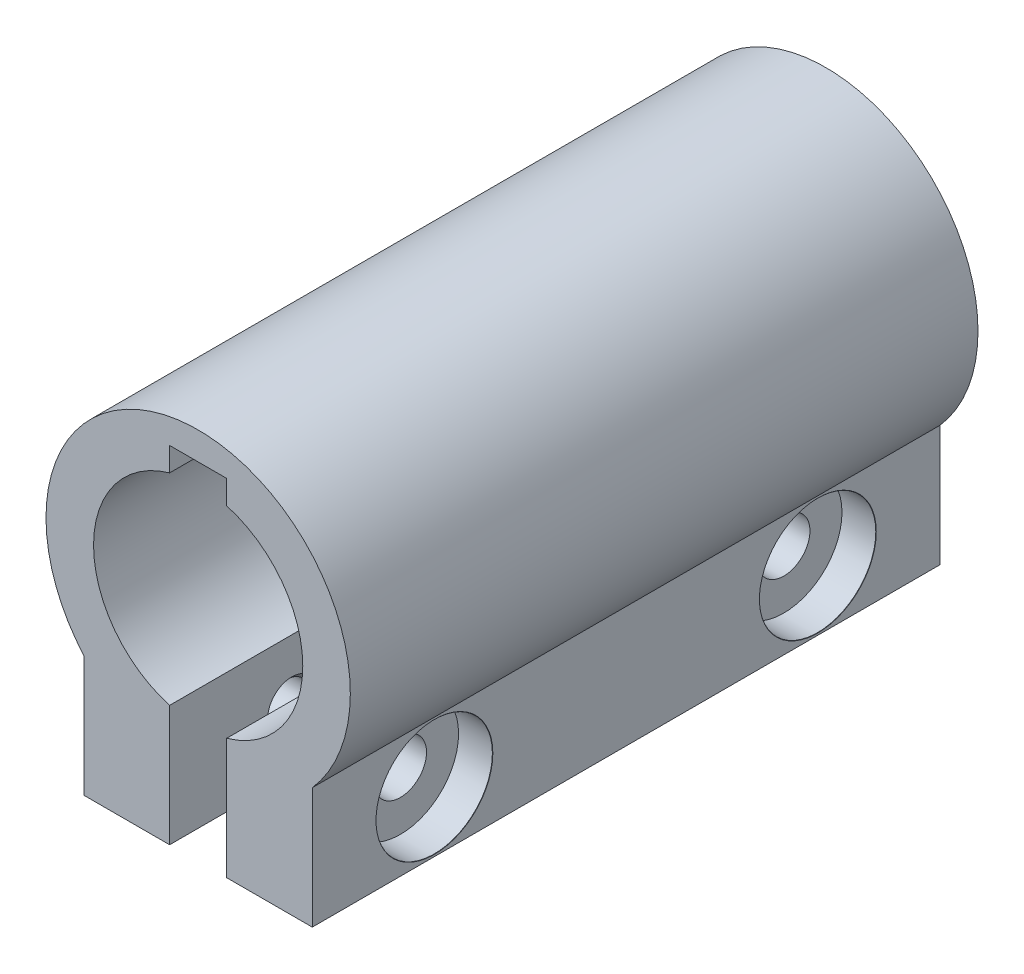
ISO-10303-21;
HEADER;
FILE_DESCRIPTION(('STEP AP214'),'2;1');
FILE_NAME('part.step','',(''),(''),'','','');
FILE_SCHEMA(('AUTOMOTIVE_DESIGN { 1 0 10303 214 1 1 1 1 }'));
ENDSEC;
DATA;
#1=APPLICATION_CONTEXT('core data for automotive mechanical design processes');
#2=APPLICATION_PROTOCOL_DEFINITION('international standard','automotive_design',2000,#1);
#3=PRODUCT_CONTEXT('',#1,'mechanical');
#4=PRODUCT('Part','Part','',(#3));
#5=PRODUCT_RELATED_PRODUCT_CATEGORY('part','',(#4));
#6=PRODUCT_DEFINITION_FORMATION('','',#4);
#7=PRODUCT_DEFINITION_CONTEXT('part definition',#1,'design');
#8=PRODUCT_DEFINITION('design','',#6,#7);
#9=PRODUCT_DEFINITION_SHAPE('','',#8);
#10=(LENGTH_UNIT() NAMED_UNIT(*) SI_UNIT(.MILLI.,.METRE.));
#11=(NAMED_UNIT(*) PLANE_ANGLE_UNIT() SI_UNIT($,.RADIAN.));
#12=(NAMED_UNIT(*) SI_UNIT($,.STERADIAN.) SOLID_ANGLE_UNIT());
#13=UNCERTAINTY_MEASURE_WITH_UNIT(LENGTH_MEASURE(1.E-05),#10,'distance_accuracy_value','');
#14=(GEOMETRIC_REPRESENTATION_CONTEXT(3) GLOBAL_UNCERTAINTY_ASSIGNED_CONTEXT((#13)) GLOBAL_UNIT_ASSIGNED_CONTEXT((#10,
#11,#12)) REPRESENTATION_CONTEXT('',''));
#15=CARTESIAN_POINT('',(0.,0.,0.));
#16=DIRECTION('',(0.,0.,1.));
#17=DIRECTION('',(1.,0.,0.));
#18=AXIS2_PLACEMENT_3D('',#15,#16,#17);
#19=CARTESIAN_POINT('',(0.,0.,-33.));
#20=DIRECTION('',(0.,0.,1.));
#21=DIRECTION('',(1.,0.,0.));
#22=AXIS2_PLACEMENT_3D('',#19,#20,#21);
#23=CYLINDRICAL_SURFACE('',#22,11.);
#24=CARTESIAN_POINT('',(0.,0.,33.));
#25=DIRECTION('',(0.,0.,1.));
#26=DIRECTION('',(1.,0.,0.));
#27=AXIS2_PLACEMENT_3D('',#24,#25,#26);
#28=CIRCLE('',#27,11.);
#29=CARTESIAN_POINT('',(-3.,10.5830052442584,33.));
#30=VERTEX_POINT('',#29);
#31=CARTESIAN_POINT('',(-3.,-10.5830052442584,33.));
#32=VERTEX_POINT('',#31);
#33=EDGE_CURVE('E160',#30,#32,#28,.T.);
#34=ORIENTED_EDGE('',*,*,#33,.T.);
#35=DIRECTION('',(0.,0.,1.));
#36=VECTOR('',#35,1.);
#37=CARTESIAN_POINT('',(-3.,-10.5830052442584,-33.));
#38=LINE('',#37,#36);
#39=CARTESIAN_POINT('',(-3.,-10.5830052442584,-33.));
#40=VERTEX_POINT('',#39);
#41=EDGE_CURVE('E151',#40,#32,#38,.T.);
#42=ORIENTED_EDGE('',*,*,#41,.F.);
#43=CARTESIAN_POINT('',(0.,0.,-33.));
#44=DIRECTION('',(0.,0.,1.));
#45=DIRECTION('',(1.,0.,0.));
#46=AXIS2_PLACEMENT_3D('',#43,#44,#45);
#47=CIRCLE('',#46,11.);
#48=CARTESIAN_POINT('',(-3.,10.5830052442584,-33.));
#49=VERTEX_POINT('',#48);
#50=EDGE_CURVE('E47',#49,#40,#47,.T.);
#51=ORIENTED_EDGE('',*,*,#50,.F.);
#52=DIRECTION('',(0.,0.,1.));
#53=VECTOR('',#52,1.);
#54=CARTESIAN_POINT('',(-3.,10.5830052442584,0.));
#55=LINE('',#54,#53);
#56=EDGE_CURVE('E256',#49,#30,#55,.T.);
#57=ORIENTED_EDGE('',*,*,#56,.T.);
#58=EDGE_LOOP('',(#34,#42,#51,#57));
#59=FACE_BOUND('',#58,.T.);
#60=ADVANCED_FACE('F38',(#59),#23,.F.);
#61=CARTESIAN_POINT('',(0.,0.,-33.));
#62=DIRECTION('',(0.,0.,1.));
#63=DIRECTION('',(1.,0.,0.));
#64=AXIS2_PLACEMENT_3D('',#61,#62,#63);
#65=CYLINDRICAL_SURFACE('',#64,16.);
#66=DIRECTION('',(0.,0.,1.));
#67=VECTOR('',#66,1.);
#68=CARTESIAN_POINT('',(12.,-10.5830052442584,-33.));
#69=LINE('',#68,#67);
#70=CARTESIAN_POINT('',(12.,-10.5830052442584,-33.));
#71=VERTEX_POINT('',#70);
#72=CARTESIAN_POINT('',(12.,-10.5830052442584,33.));
#73=VERTEX_POINT('',#72);
#74=EDGE_CURVE('E216',#71,#73,#69,.T.);
#75=ORIENTED_EDGE('',*,*,#74,.F.);
#76=CARTESIAN_POINT('',(0.,0.,-33.));
#77=DIRECTION('',(0.,0.,1.));
#78=DIRECTION('',(1.,0.,0.));
#79=AXIS2_PLACEMENT_3D('',#76,#77,#78);
#80=CIRCLE('',#79,16.);
#81=CARTESIAN_POINT('',(-12.,-10.5830052442584,-33.));
#82=VERTEX_POINT('',#81);
#83=EDGE_CURVE('E11',#71,#82,#80,.T.);
#84=ORIENTED_EDGE('',*,*,#83,.T.);
#85=DIRECTION('',(0.,0.,1.));
#86=VECTOR('',#85,1.);
#87=CARTESIAN_POINT('',(-12.,-10.5830052442584,-33.));
#88=LINE('',#87,#86);
#89=CARTESIAN_POINT('',(-12.,-10.5830052442584,33.));
#90=VERTEX_POINT('',#89);
#91=EDGE_CURVE('E232',#82,#90,#88,.T.);
#92=ORIENTED_EDGE('',*,*,#91,.T.);
#93=CARTESIAN_POINT('',(0.,0.,33.));
#94=DIRECTION('',(0.,0.,1.));
#95=DIRECTION('',(1.,0.,0.));
#96=AXIS2_PLACEMENT_3D('',#93,#94,#95);
#97=CIRCLE('',#96,16.);
#98=EDGE_CURVE('E158',#73,#90,#97,.T.);
#99=ORIENTED_EDGE('',*,*,#98,.F.);
#100=EDGE_LOOP('',(#75,#84,#92,#99));
#101=FACE_BOUND('',#100,.T.);
#102=ADVANCED_FACE('F40',(#101),#65,.T.);
#103=CARTESIAN_POINT('',(0.,0.,-33.));
#104=DIRECTION('',(0.,0.,1.));
#105=DIRECTION('',(1.,0.,0.));
#106=AXIS2_PLACEMENT_3D('',#103,#104,#105);
#107=PLANE('',#106);
#108=ORIENTED_EDGE('',*,*,#50,.T.);
#109=DIRECTION('',(0.,-1.,0.));
#110=VECTOR('',#109,1.);
#111=CARTESIAN_POINT('',(-3.,0.,-33.));
#112=LINE('',#111,#110);
#113=CARTESIAN_POINT('',(-3.,-23.2830052442584,-33.));
#114=VERTEX_POINT('',#113);
#115=EDGE_CURVE('E224',#40,#114,#112,.T.);
#116=ORIENTED_EDGE('',*,*,#115,.T.);
#117=DIRECTION('',(-1.,0.,0.));
#118=VECTOR('',#117,1.);
#119=CARTESIAN_POINT('',(0.,-23.2830052442584,-33.));
#120=LINE('',#119,#118);
#121=CARTESIAN_POINT('',(-12.,-23.2830052442584,-33.));
#122=VERTEX_POINT('',#121);
#123=EDGE_CURVE('E222',#114,#122,#120,.T.);
#124=ORIENTED_EDGE('',*,*,#123,.T.);
#125=DIRECTION('',(0.,1.,0.));
#126=VECTOR('',#125,1.);
#127=CARTESIAN_POINT('',(-12.,0.,-33.));
#128=LINE('',#127,#126);
#129=EDGE_CURVE('E219',#122,#82,#128,.T.);
#130=ORIENTED_EDGE('',*,*,#129,.T.);
#131=ORIENTED_EDGE('',*,*,#83,.F.);
#132=DIRECTION('',(0.,1.,0.));
#133=VECTOR('',#132,1.);
#134=CARTESIAN_POINT('',(12.,0.,-33.));
#135=LINE('',#134,#133);
#136=CARTESIAN_POINT('',(12.,-23.2830052442584,-33.));
#137=VERTEX_POINT('',#136);
#138=EDGE_CURVE('E143',#137,#71,#135,.T.);
#139=ORIENTED_EDGE('',*,*,#138,.F.);
#140=DIRECTION('',(1.,0.,0.));
#141=VECTOR('',#140,1.);
#142=CARTESIAN_POINT('',(0.,-23.2830052442584,-33.));
#143=LINE('',#142,#141);
#144=CARTESIAN_POINT('',(2.99999999999998,-23.2830052442584,-33.));
#145=VERTEX_POINT('',#144);
#146=EDGE_CURVE('E138',#145,#137,#143,.T.);
#147=ORIENTED_EDGE('',*,*,#146,.F.);
#148=DIRECTION('',(0.,-1.,0.));
#149=VECTOR('',#148,1.);
#150=CARTESIAN_POINT('',(3.00000000000003,0.,-33.));
#151=LINE('',#150,#149);
#152=CARTESIAN_POINT('',(3.,-10.5830052442584,-33.));
#153=VERTEX_POINT('',#152);
#154=EDGE_CURVE('E128',#153,#145,#151,.T.);
#155=ORIENTED_EDGE('',*,*,#154,.F.);
#156=CARTESIAN_POINT('',(3.,10.5830052442584,-33.));
#157=VERTEX_POINT('',#156);
#158=EDGE_CURVE('E134',#153,#157,#47,.T.);
#159=ORIENTED_EDGE('',*,*,#158,.T.);
#160=DIRECTION('',(0.,1.,0.));
#161=VECTOR('',#160,1.);
#162=CARTESIAN_POINT('',(3.,13.0830052442584,-33.));
#163=LINE('',#162,#161);
#164=CARTESIAN_POINT('',(3.,13.0830052442584,-33.));
#165=VERTEX_POINT('',#164);
#166=EDGE_CURVE('E246',#157,#165,#163,.T.);
#167=ORIENTED_EDGE('',*,*,#166,.T.);
#168=DIRECTION('',(-1.,0.,0.));
#169=VECTOR('',#168,1.);
#170=CARTESIAN_POINT('',(0.,13.0830052442584,-33.));
#171=LINE('',#170,#169);
#172=CARTESIAN_POINT('',(-3.,13.0830052442584,-33.));
#173=VERTEX_POINT('',#172);
#174=EDGE_CURVE('E243',#165,#173,#171,.T.);
#175=ORIENTED_EDGE('',*,*,#174,.T.);
#176=DIRECTION('',(0.,-1.,0.));
#177=VECTOR('',#176,1.);
#178=CARTESIAN_POINT('',(-3.,10.5830052442584,-33.));
#179=LINE('',#178,#177);
#180=EDGE_CURVE('E235',#173,#49,#179,.T.);
#181=ORIENTED_EDGE('',*,*,#180,.T.);
#182=EDGE_LOOP('',(#108,#116,#124,#130,#131,#139,#147,#155,#159,#167,#175,#181));
#183=FACE_BOUND('',#182,.T.);
#184=ADVANCED_FACE('F131',(#183),#107,.F.);
#185=ORIENTED_EDGE('',*,*,#158,.F.);
#186=DIRECTION('',(0.,0.,1.));
#187=VECTOR('',#186,1.);
#188=CARTESIAN_POINT('',(3.,-10.5830052442584,-33.));
#189=LINE('',#188,#187);
#190=CARTESIAN_POINT('',(3.,-10.5830052442584,33.));
#191=VERTEX_POINT('',#190);
#192=EDGE_CURVE('E146',#153,#191,#189,.T.);
#193=ORIENTED_EDGE('',*,*,#192,.T.);
#194=CARTESIAN_POINT('',(3.,10.5830052442584,33.));
#195=VERTEX_POINT('',#194);
#196=EDGE_CURVE('E259',#191,#195,#28,.T.);
#197=ORIENTED_EDGE('',*,*,#196,.T.);
#198=DIRECTION('',(0.,0.,1.));
#199=VECTOR('',#198,1.);
#200=CARTESIAN_POINT('',(3.,10.5830052442584,0.));
#201=LINE('',#200,#199);
#202=EDGE_CURVE('E156',#157,#195,#201,.T.);
#203=ORIENTED_EDGE('',*,*,#202,.F.);
#204=EDGE_LOOP('',(#185,#193,#197,#203));
#205=FACE_BOUND('',#204,.T.);
#206=ADVANCED_FACE('F154',(#205),#23,.F.);
#207=CARTESIAN_POINT('',(0.,0.,33.));
#208=DIRECTION('',(0.,0.,1.));
#209=DIRECTION('',(1.,0.,0.));
#210=AXIS2_PLACEMENT_3D('',#207,#208,#209);
#211=PLANE('',#210);
#212=DIRECTION('',(0.,-1.,0.));
#213=VECTOR('',#212,1.);
#214=CARTESIAN_POINT('',(-3.,0.,33.));
#215=LINE('',#214,#213);
#216=CARTESIAN_POINT('',(-3.,-23.2830052442584,33.));
#217=VERTEX_POINT('',#216);
#218=EDGE_CURVE('E55',#32,#217,#215,.T.);
#219=ORIENTED_EDGE('',*,*,#218,.F.);
#220=ORIENTED_EDGE('',*,*,#33,.F.);
#221=DIRECTION('',(0.,-1.,0.));
#222=VECTOR('',#221,1.);
#223=CARTESIAN_POINT('',(-3.,10.5830052442584,33.));
#224=LINE('',#223,#222);
#225=CARTESIAN_POINT('',(-3.,13.0830052442584,33.));
#226=VERTEX_POINT('',#225);
#227=EDGE_CURVE('E254',#226,#30,#224,.T.);
#228=ORIENTED_EDGE('',*,*,#227,.F.);
#229=DIRECTION('',(-1.,0.,0.));
#230=VECTOR('',#229,1.);
#231=CARTESIAN_POINT('',(-3.,13.0830052442584,33.));
#232=LINE('',#231,#230);
#233=CARTESIAN_POINT('',(3.,13.0830052442584,33.));
#234=VERTEX_POINT('',#233);
#235=EDGE_CURVE('E251',#234,#226,#232,.T.);
#236=ORIENTED_EDGE('',*,*,#235,.F.);
#237=DIRECTION('',(0.,1.,0.));
#238=VECTOR('',#237,1.);
#239=CARTESIAN_POINT('',(3.,13.0830052442584,33.));
#240=LINE('',#239,#238);
#241=EDGE_CURVE('E248',#195,#234,#240,.T.);
#242=ORIENTED_EDGE('',*,*,#241,.F.);
#243=ORIENTED_EDGE('',*,*,#196,.F.);
#244=DIRECTION('',(0.,-1.,0.));
#245=VECTOR('',#244,1.);
#246=CARTESIAN_POINT('',(3.00000000000003,0.,33.));
#247=LINE('',#246,#245);
#248=CARTESIAN_POINT('',(2.99999999999998,-23.2830052442584,33.));
#249=VERTEX_POINT('',#248);
#250=EDGE_CURVE('E148',#191,#249,#247,.T.);
#251=ORIENTED_EDGE('',*,*,#250,.T.);
#252=DIRECTION('',(1.,0.,0.));
#253=VECTOR('',#252,1.);
#254=CARTESIAN_POINT('',(0.,-23.2830052442584,33.));
#255=LINE('',#254,#253);
#256=CARTESIAN_POINT('',(12.,-23.2830052442584,33.));
#257=VERTEX_POINT('',#256);
#258=EDGE_CURVE('E206',#249,#257,#255,.T.);
#259=ORIENTED_EDGE('',*,*,#258,.T.);
#260=DIRECTION('',(0.,1.,0.));
#261=VECTOR('',#260,1.);
#262=CARTESIAN_POINT('',(12.,0.,33.));
#263=LINE('',#262,#261);
#264=EDGE_CURVE('E62',#257,#73,#263,.T.);
#265=ORIENTED_EDGE('',*,*,#264,.T.);
#266=ORIENTED_EDGE('',*,*,#98,.T.);
#267=DIRECTION('',(0.,1.,0.));
#268=VECTOR('',#267,1.);
#269=CARTESIAN_POINT('',(-12.,0.,33.));
#270=LINE('',#269,#268);
#271=CARTESIAN_POINT('',(-12.,-23.2830052442584,33.));
#272=VERTEX_POINT('',#271);
#273=EDGE_CURVE('E215',#272,#90,#270,.T.);
#274=ORIENTED_EDGE('',*,*,#273,.F.);
#275=DIRECTION('',(-1.,0.,0.));
#276=VECTOR('',#275,1.);
#277=CARTESIAN_POINT('',(0.,-23.2830052442584,33.));
#278=LINE('',#277,#276);
#279=EDGE_CURVE('E229',#217,#272,#278,.T.);
#280=ORIENTED_EDGE('',*,*,#279,.F.);
#281=EDGE_LOOP('',(#219,#220,#228,#236,#242,#243,#251,#259,#265,#266,#274,#280));
#282=FACE_BOUND('',#281,.T.);
#283=ADVANCED_FACE('F271',(#282),#211,.T.);
#284=CARTESIAN_POINT('',(-3.,10.5830052442584,0.));
#285=DIRECTION('',(-1.,0.,0.));
#286=DIRECTION('',(0.,0.,1.));
#287=AXIS2_PLACEMENT_3D('',#284,#285,#286);
#288=PLANE('',#287);
#289=ORIENTED_EDGE('',*,*,#227,.T.);
#290=ORIENTED_EDGE('',*,*,#56,.F.);
#291=ORIENTED_EDGE('',*,*,#180,.F.);
#292=DIRECTION('',(0.,0.,1.));
#293=VECTOR('',#292,1.);
#294=CARTESIAN_POINT('',(-3.,13.0830052442584,0.));
#295=LINE('',#294,#293);
#296=EDGE_CURVE('E260',#173,#226,#295,.T.);
#297=ORIENTED_EDGE('',*,*,#296,.T.);
#298=EDGE_LOOP('',(#289,#290,#291,#297));
#299=FACE_BOUND('',#298,.T.);
#300=ADVANCED_FACE('F327',(#299),#288,.F.);
#301=CARTESIAN_POINT('',(-3.,13.0830052442584,0.));
#302=DIRECTION('',(0.,1.,0.));
#303=DIRECTION('',(0.,0.,1.));
#304=AXIS2_PLACEMENT_3D('',#301,#302,#303);
#305=PLANE('',#304);
#306=ORIENTED_EDGE('',*,*,#235,.T.);
#307=ORIENTED_EDGE('',*,*,#296,.F.);
#308=ORIENTED_EDGE('',*,*,#174,.F.);
#309=DIRECTION('',(0.,0.,1.));
#310=VECTOR('',#309,1.);
#311=CARTESIAN_POINT('',(3.,13.0830052442584,0.));
#312=LINE('',#311,#310);
#313=EDGE_CURVE('E262',#165,#234,#312,.T.);
#314=ORIENTED_EDGE('',*,*,#313,.T.);
#315=EDGE_LOOP('',(#306,#307,#308,#314));
#316=FACE_BOUND('',#315,.T.);
#317=ADVANCED_FACE('F274',(#316),#305,.F.);
#318=CARTESIAN_POINT('',(3.,13.0830052442584,0.));
#319=DIRECTION('',(1.,0.,0.));
#320=DIRECTION('',(0.,0.,-1.));
#321=AXIS2_PLACEMENT_3D('',#318,#319,#320);
#322=PLANE('',#321);
#323=ORIENTED_EDGE('',*,*,#241,.T.);
#324=ORIENTED_EDGE('',*,*,#313,.F.);
#325=ORIENTED_EDGE('',*,*,#166,.F.);
#326=ORIENTED_EDGE('',*,*,#202,.T.);
#327=EDGE_LOOP('',(#323,#324,#325,#326));
#328=FACE_BOUND('',#327,.T.);
#329=ADVANCED_FACE('F269',(#328),#322,.F.);
#330=CARTESIAN_POINT('',(-12.,0.,-33.));
#331=DIRECTION('',(1.,0.,0.));
#332=DIRECTION('',(0.,0.,-1.));
#333=AXIS2_PLACEMENT_3D('',#330,#331,#332);
#334=PLANE('',#333);
#335=CARTESIAN_POINT('',(-12.,-16.9330052442584,-20.1581671408917));
#336=DIRECTION('',(1.,0.,0.));
#337=DIRECTION('',(0.,0.,-1.));
#338=AXIS2_PLACEMENT_3D('',#335,#336,#337);
#339=CIRCLE('',#338,2.1);
#340=CARTESIAN_POINT('',(-12.,-16.9330052442584,-22.2581671408917));
#341=VERTEX_POINT('',#340);
#342=EDGE_CURVE('E42',#341,#341,#339,.T.);
#343=ORIENTED_EDGE('',*,*,#342,.T.);
#344=EDGE_LOOP('',(#343));
#345=FACE_BOUND('',#344,.T.);
#346=CARTESIAN_POINT('',(-12.,-16.9330052442584,20.1581671408917));
#347=DIRECTION('',(1.,0.,0.));
#348=DIRECTION('',(0.,0.,-1.));
#349=AXIS2_PLACEMENT_3D('',#346,#347,#348);
#350=CIRCLE('',#349,2.1);
#351=CARTESIAN_POINT('',(-12.,-16.9330052442584,18.0581671408917));
#352=VERTEX_POINT('',#351);
#353=EDGE_CURVE('E171',#352,#352,#350,.T.);
#354=ORIENTED_EDGE('',*,*,#353,.T.);
#355=EDGE_LOOP('',(#354));
#356=FACE_BOUND('',#355,.T.);
#357=ORIENTED_EDGE('',*,*,#273,.T.);
#358=ORIENTED_EDGE('',*,*,#91,.F.);
#359=ORIENTED_EDGE('',*,*,#129,.F.);
#360=DIRECTION('',(0.,0.,1.));
#361=VECTOR('',#360,1.);
#362=CARTESIAN_POINT('',(-12.,-23.2830052442584,-33.));
#363=LINE('',#362,#361);
#364=EDGE_CURVE('E226',#122,#272,#363,.T.);
#365=ORIENTED_EDGE('',*,*,#364,.T.);
#366=EDGE_LOOP('',(#357,#358,#359,#365));
#367=FACE_BOUND('',#366,.T.);
#368=ADVANCED_FACE('F291',(#345,#356,#367),#334,.F.);
#369=CARTESIAN_POINT('',(-3.,0.,-33.));
#370=DIRECTION('',(-1.,0.,0.));
#371=DIRECTION('',(0.,0.,1.));
#372=AXIS2_PLACEMENT_3D('',#369,#370,#371);
#373=PLANE('',#372);
#374=CARTESIAN_POINT('',(-3.,-16.9330052442584,-20.1581671408917));
#375=DIRECTION('',(1.,0.,0.));
#376=DIRECTION('',(0.,0.,-1.));
#377=AXIS2_PLACEMENT_3D('',#374,#375,#376);
#378=CIRCLE('',#377,2.525);
#379=CARTESIAN_POINT('',(-3.,-16.9330052442584,-22.6831671408917));
#380=VERTEX_POINT('',#379);
#381=EDGE_CURVE('E530',#380,#380,#378,.T.);
#382=ORIENTED_EDGE('',*,*,#381,.F.);
#383=EDGE_LOOP('',(#382));
#384=FACE_BOUND('',#383,.T.);
#385=CARTESIAN_POINT('',(-3.,-16.9330052442584,20.1581671408917));
#386=DIRECTION('',(1.,0.,0.));
#387=DIRECTION('',(0.,0.,-1.));
#388=AXIS2_PLACEMENT_3D('',#385,#386,#387);
#389=CIRCLE('',#388,2.525);
#390=CARTESIAN_POINT('',(-3.,-16.9330052442584,17.6331671408917));
#391=VERTEX_POINT('',#390);
#392=EDGE_CURVE('E181',#391,#391,#389,.T.);
#393=ORIENTED_EDGE('',*,*,#392,.F.);
#394=EDGE_LOOP('',(#393));
#395=FACE_BOUND('',#394,.T.);
#396=DIRECTION('',(0.,0.,1.));
#397=VECTOR('',#396,1.);
#398=CARTESIAN_POINT('',(-3.,-23.2830052442584,-33.));
#399=LINE('',#398,#397);
#400=EDGE_CURVE('E236',#114,#217,#399,.T.);
#401=ORIENTED_EDGE('',*,*,#400,.F.);
#402=ORIENTED_EDGE('',*,*,#115,.F.);
#403=ORIENTED_EDGE('',*,*,#41,.T.);
#404=ORIENTED_EDGE('',*,*,#218,.T.);
#405=EDGE_LOOP('',(#401,#402,#403,#404));
#406=FACE_BOUND('',#405,.T.);
#407=ADVANCED_FACE('F281',(#384,#395,#406),#373,.F.);
#408=CARTESIAN_POINT('',(0.,-23.2830052442584,-33.));
#409=DIRECTION('',(0.,1.,0.));
#410=DIRECTION('',(0.,0.,1.));
#411=AXIS2_PLACEMENT_3D('',#408,#409,#410);
#412=PLANE('',#411);
#413=ORIENTED_EDGE('',*,*,#279,.T.);
#414=ORIENTED_EDGE('',*,*,#364,.F.);
#415=ORIENTED_EDGE('',*,*,#123,.F.);
#416=ORIENTED_EDGE('',*,*,#400,.T.);
#417=EDGE_LOOP('',(#413,#414,#415,#416));
#418=FACE_BOUND('',#417,.T.);
#419=ADVANCED_FACE('F288',(#418),#412,.F.);
#420=CARTESIAN_POINT('',(0.,-23.2830052442584,-33.));
#421=DIRECTION('',(0.,-1.,0.));
#422=DIRECTION('',(0.,0.,-1.));
#423=AXIS2_PLACEMENT_3D('',#420,#421,#422);
#424=PLANE('',#423);
#425=ORIENTED_EDGE('',*,*,#258,.F.);
#426=DIRECTION('',(0.,0.,1.));
#427=VECTOR('',#426,1.);
#428=CARTESIAN_POINT('',(2.99999999999998,-23.2830052442584,-33.));
#429=LINE('',#428,#427);
#430=EDGE_CURVE('E213',#145,#249,#429,.T.);
#431=ORIENTED_EDGE('',*,*,#430,.F.);
#432=ORIENTED_EDGE('',*,*,#146,.T.);
#433=DIRECTION('',(0.,0.,1.));
#434=VECTOR('',#433,1.);
#435=CARTESIAN_POINT('',(12.,-23.2830052442584,-33.));
#436=LINE('',#435,#434);
#437=EDGE_CURVE('E142',#137,#257,#436,.T.);
#438=ORIENTED_EDGE('',*,*,#437,.T.);
#439=EDGE_LOOP('',(#425,#431,#432,#438));
#440=FACE_BOUND('',#439,.T.);
#441=ADVANCED_FACE('F298',(#440),#424,.T.);
#442=CARTESIAN_POINT('',(3.00000000000003,0.,-33.));
#443=DIRECTION('',(-1.,0.,0.));
#444=DIRECTION('',(0.,-1.,0.));
#445=AXIS2_PLACEMENT_3D('',#442,#443,#444);
#446=PLANE('',#445);
#447=CARTESIAN_POINT('',(3.,-16.9330052442584,-20.1581671408917));
#448=DIRECTION('',(-1.,0.,0.));
#449=DIRECTION('',(0.,-1.,0.));
#450=AXIS2_PLACEMENT_3D('',#447,#448,#449);
#451=CIRCLE('',#450,2.75);
#452=CARTESIAN_POINT('',(2.99999999999999,-19.6830052442584,-20.1581671408917));
#453=VERTEX_POINT('',#452);
#454=EDGE_CURVE('E167',#453,#453,#451,.T.);
#455=ORIENTED_EDGE('',*,*,#454,.F.);
#456=EDGE_LOOP('',(#455));
#457=FACE_BOUND('',#456,.T.);
#458=CARTESIAN_POINT('',(3.,-16.9330052442584,20.1581671408917));
#459=DIRECTION('',(-1.,0.,0.));
#460=DIRECTION('',(0.,-1.,0.));
#461=AXIS2_PLACEMENT_3D('',#458,#459,#460);
#462=CIRCLE('',#461,2.75);
#463=CARTESIAN_POINT('',(2.99999999999999,-19.6830052442584,20.1581671408917));
#464=VERTEX_POINT('',#463);
#465=EDGE_CURVE('E152',#464,#464,#462,.T.);
#466=ORIENTED_EDGE('',*,*,#465,.F.);
#467=EDGE_LOOP('',(#466));
#468=FACE_BOUND('',#467,.T.);
#469=ORIENTED_EDGE('',*,*,#430,.T.);
#470=ORIENTED_EDGE('',*,*,#250,.F.);
#471=ORIENTED_EDGE('',*,*,#192,.F.);
#472=ORIENTED_EDGE('',*,*,#154,.T.);
#473=EDGE_LOOP('',(#469,#470,#471,#472));
#474=FACE_BOUND('',#473,.T.);
#475=ADVANCED_FACE('F147',(#457,#468,#474),#446,.T.);
#476=CARTESIAN_POINT('',(12.,0.,-33.));
#477=DIRECTION('',(1.,0.,0.));
#478=DIRECTION('',(0.,1.,0.));
#479=AXIS2_PLACEMENT_3D('',#476,#477,#478);
#480=PLANE('',#479);
#481=CARTESIAN_POINT('',(12.,-16.9330052442584,-20.1581671408917));
#482=DIRECTION('',(1.,0.,0.));
#483=DIRECTION('',(0.,0.,-1.));
#484=AXIS2_PLACEMENT_3D('',#481,#482,#483);
#485=CIRCLE('',#484,6.145);
#486=CARTESIAN_POINT('',(12.,-16.9330052442584,-26.3031671408917));
#487=VERTEX_POINT('',#486);
#488=EDGE_CURVE('E173',#487,#487,#485,.T.);
#489=ORIENTED_EDGE('',*,*,#488,.F.);
#490=EDGE_LOOP('',(#489));
#491=FACE_BOUND('',#490,.T.);
#492=CARTESIAN_POINT('',(12.,-16.9330052442584,20.1581671408917));
#493=DIRECTION('',(1.,0.,0.));
#494=DIRECTION('',(0.,0.,-1.));
#495=AXIS2_PLACEMENT_3D('',#492,#493,#494);
#496=CIRCLE('',#495,6.145);
#497=CARTESIAN_POINT('',(12.,-16.9330052442584,14.0131671408917));
#498=VERTEX_POINT('',#497);
#499=EDGE_CURVE('E169',#498,#498,#496,.T.);
#500=ORIENTED_EDGE('',*,*,#499,.F.);
#501=EDGE_LOOP('',(#500));
#502=FACE_BOUND('',#501,.T.);
#503=ORIENTED_EDGE('',*,*,#264,.F.);
#504=ORIENTED_EDGE('',*,*,#437,.F.);
#505=ORIENTED_EDGE('',*,*,#138,.T.);
#506=ORIENTED_EDGE('',*,*,#74,.T.);
#507=EDGE_LOOP('',(#503,#504,#505,#506));
#508=FACE_BOUND('',#507,.T.);
#509=ADVANCED_FACE('F299',(#491,#502,#508),#480,.T.);
#510=CARTESIAN_POINT('',(12.,-16.9330052442584,20.1581671408917));
#511=DIRECTION('',(1.,0.,0.));
#512=DIRECTION('',(0.,0.,-1.));
#513=AXIS2_PLACEMENT_3D('',#510,#511,#512);
#514=CYLINDRICAL_SURFACE('',#513,2.75);
#515=ORIENTED_EDGE('',*,*,#465,.T.);
#516=EDGE_LOOP('',(#515));
#517=FACE_BOUND('',#516,.T.);
#518=CARTESIAN_POINT('',(8.42,-16.9330052442584,20.1581671408917));
#519=DIRECTION('',(1.,0.,0.));
#520=DIRECTION('',(0.,0.,-1.));
#521=AXIS2_PLACEMENT_3D('',#518,#519,#520);
#522=CIRCLE('',#521,2.75);
#523=CARTESIAN_POINT('',(8.42,-16.9330052442584,17.4081671408917));
#524=VERTEX_POINT('',#523);
#525=EDGE_CURVE('E166',#524,#524,#522,.T.);
#526=ORIENTED_EDGE('',*,*,#525,.T.);
#527=EDGE_LOOP('',(#526));
#528=FACE_BOUND('',#527,.T.);
#529=ADVANCED_FACE('F301',(#517,#528),#514,.F.);
#530=CARTESIAN_POINT('',(8.42,-14.1830052442584,20.1581671408917));
#531=DIRECTION('',(-1.,0.,0.));
#532=DIRECTION('',(0.,0.,1.));
#533=AXIS2_PLACEMENT_3D('',#530,#531,#532);
#534=PLANE('',#533);
#535=ORIENTED_EDGE('',*,*,#525,.F.);
#536=EDGE_LOOP('',(#535));
#537=FACE_BOUND('',#536,.T.);
#538=CARTESIAN_POINT('',(8.42,-16.9330052442584,20.1581671408917));
#539=DIRECTION('',(1.,0.,0.));
#540=DIRECTION('',(0.,0.,-1.));
#541=AXIS2_PLACEMENT_3D('',#538,#539,#540);
#542=CIRCLE('',#541,6.12);
#543=CARTESIAN_POINT('',(8.42,-16.9330052442584,14.0381671408917));
#544=VERTEX_POINT('',#543);
#545=EDGE_CURVE('E201',#544,#544,#542,.T.);
#546=ORIENTED_EDGE('',*,*,#545,.T.);
#547=EDGE_LOOP('',(#546));
#548=FACE_BOUND('',#547,.T.);
#549=ADVANCED_FACE('F308',(#537,#548),#534,.F.);
#550=CARTESIAN_POINT('',(12.,-16.9330052442584,20.1581671408917));
#551=DIRECTION('',(1.,0.,0.));
#552=DIRECTION('',(0.,0.,-1.));
#553=AXIS2_PLACEMENT_3D('',#550,#551,#552);
#554=CYLINDRICAL_SURFACE('',#553,6.12);
#555=ORIENTED_EDGE('',*,*,#545,.F.);
#556=EDGE_LOOP('',(#555));
#557=FACE_BOUND('',#556,.T.);
#558=CARTESIAN_POINT('',(11.975,-16.9330052442584,20.1581671408917));
#559=DIRECTION('',(1.,0.,0.));
#560=DIRECTION('',(0.,0.,-1.));
#561=AXIS2_PLACEMENT_3D('',#558,#559,#560);
#562=CIRCLE('',#561,6.12);
#563=CARTESIAN_POINT('',(11.975,-16.9330052442584,14.0381671408917));
#564=VERTEX_POINT('',#563);
#565=EDGE_CURVE('E198',#564,#564,#562,.T.);
#566=ORIENTED_EDGE('',*,*,#565,.T.);
#567=EDGE_LOOP('',(#566));
#568=FACE_BOUND('',#567,.T.);
#569=ADVANCED_FACE('F404',(#557,#568),#554,.F.);
#570=CARTESIAN_POINT('',(12.,-16.9330052442584,20.1581671408917));
#571=DIRECTION('',(1.,0.,0.));
#572=DIRECTION('',(0.,0.,-1.));
#573=AXIS2_PLACEMENT_3D('',#570,#571,#572);
#574=CONICAL_SURFACE('',#573,6.145,0.785398163397344);
#575=ORIENTED_EDGE('',*,*,#565,.F.);
#576=EDGE_LOOP('',(#575));
#577=FACE_BOUND('',#576,.T.);
#578=ORIENTED_EDGE('',*,*,#499,.T.);
#579=EDGE_LOOP('',(#578));
#580=FACE_BOUND('',#579,.T.);
#581=ADVANCED_FACE('F413',(#577,#580),#574,.F.);
#582=CARTESIAN_POINT('',(12.,-16.9330052442584,-20.1581671408917));
#583=DIRECTION('',(1.,0.,0.));
#584=DIRECTION('',(0.,0.,-1.));
#585=AXIS2_PLACEMENT_3D('',#582,#583,#584);
#586=CYLINDRICAL_SURFACE('',#585,2.75);
#587=ORIENTED_EDGE('',*,*,#454,.T.);
#588=EDGE_LOOP('',(#587));
#589=FACE_BOUND('',#588,.T.);
#590=CARTESIAN_POINT('',(8.42,-16.9330052442584,-20.1581671408917));
#591=DIRECTION('',(1.,0.,0.));
#592=DIRECTION('',(0.,0.,-1.));
#593=AXIS2_PLACEMENT_3D('',#590,#591,#592);
#594=CIRCLE('',#593,2.75);
#595=CARTESIAN_POINT('',(8.42,-16.9330052442584,-22.9081671408917));
#596=VERTEX_POINT('',#595);
#597=EDGE_CURVE('E170',#596,#596,#594,.T.);
#598=ORIENTED_EDGE('',*,*,#597,.T.);
#599=EDGE_LOOP('',(#598));
#600=FACE_BOUND('',#599,.T.);
#601=ADVANCED_FACE('F421',(#589,#600),#586,.F.);
#602=CARTESIAN_POINT('',(8.42,-14.1830052442584,-20.1581671408917));
#603=DIRECTION('',(-1.,0.,0.));
#604=DIRECTION('',(0.,0.,1.));
#605=AXIS2_PLACEMENT_3D('',#602,#603,#604);
#606=PLANE('',#605);
#607=ORIENTED_EDGE('',*,*,#597,.F.);
#608=EDGE_LOOP('',(#607));
#609=FACE_BOUND('',#608,.T.);
#610=CARTESIAN_POINT('',(8.42,-16.9330052442584,-20.1581671408917));
#611=DIRECTION('',(1.,0.,0.));
#612=DIRECTION('',(0.,0.,-1.));
#613=AXIS2_PLACEMENT_3D('',#610,#611,#612);
#614=CIRCLE('',#613,6.12);
#615=CARTESIAN_POINT('',(8.42,-16.9330052442584,-26.2781671408917));
#616=VERTEX_POINT('',#615);
#617=EDGE_CURVE('E191',#616,#616,#614,.T.);
#618=ORIENTED_EDGE('',*,*,#617,.T.);
#619=EDGE_LOOP('',(#618));
#620=FACE_BOUND('',#619,.T.);
#621=ADVANCED_FACE('F430',(#609,#620),#606,.F.);
#622=CARTESIAN_POINT('',(12.,-16.9330052442584,-20.1581671408917));
#623=DIRECTION('',(1.,0.,0.));
#624=DIRECTION('',(0.,0.,-1.));
#625=AXIS2_PLACEMENT_3D('',#622,#623,#624);
#626=CYLINDRICAL_SURFACE('',#625,6.12);
#627=ORIENTED_EDGE('',*,*,#617,.F.);
#628=EDGE_LOOP('',(#627));
#629=FACE_BOUND('',#628,.T.);
#630=CARTESIAN_POINT('',(11.975,-16.9330052442584,-20.1581671408917));
#631=DIRECTION('',(1.,0.,0.));
#632=DIRECTION('',(0.,0.,-1.));
#633=AXIS2_PLACEMENT_3D('',#630,#631,#632);
#634=CIRCLE('',#633,6.12);
#635=CARTESIAN_POINT('',(11.975,-16.9330052442584,-26.2781671408917));
#636=VERTEX_POINT('',#635);
#637=EDGE_CURVE('E178',#636,#636,#634,.T.);
#638=ORIENTED_EDGE('',*,*,#637,.T.);
#639=EDGE_LOOP('',(#638));
#640=FACE_BOUND('',#639,.T.);
#641=ADVANCED_FACE('F439',(#629,#640),#626,.F.);
#642=CARTESIAN_POINT('',(12.,-16.9330052442584,-20.1581671408917));
#643=DIRECTION('',(1.,0.,0.));
#644=DIRECTION('',(0.,0.,-1.));
#645=AXIS2_PLACEMENT_3D('',#642,#643,#644);
#646=CONICAL_SURFACE('',#645,6.145,0.785398163397344);
#647=ORIENTED_EDGE('',*,*,#637,.F.);
#648=EDGE_LOOP('',(#647));
#649=FACE_BOUND('',#648,.T.);
#650=ORIENTED_EDGE('',*,*,#488,.T.);
#651=EDGE_LOOP('',(#650));
#652=FACE_BOUND('',#651,.T.);
#653=ADVANCED_FACE('F448',(#649,#652),#646,.F.);
#654=CARTESIAN_POINT('',(-3.,-16.9330052442584,20.1581671408917));
#655=DIRECTION('',(1.,0.,0.));
#656=DIRECTION('',(0.,0.,-1.));
#657=AXIS2_PLACEMENT_3D('',#654,#655,#656);
#658=CYLINDRICAL_SURFACE('',#657,2.1);
#659=CARTESIAN_POINT('',(-3.425,-16.9330052442584,20.1581671408917));
#660=DIRECTION('',(1.,0.,0.));
#661=DIRECTION('',(0.,0.,-1.));
#662=AXIS2_PLACEMENT_3D('',#659,#660,#661);
#663=CIRCLE('',#662,2.1);
#664=CARTESIAN_POINT('',(-3.425,-16.9330052442584,18.0581671408917));
#665=VERTEX_POINT('',#664);
#666=EDGE_CURVE('E174',#665,#665,#663,.T.);
#667=ORIENTED_EDGE('',*,*,#666,.T.);
#668=EDGE_LOOP('',(#667));
#669=FACE_BOUND('',#668,.T.);
#670=ORIENTED_EDGE('',*,*,#353,.F.);
#671=EDGE_LOOP('',(#670));
#672=FACE_BOUND('',#671,.T.);
#673=ADVANCED_FACE('F457',(#669,#672),#658,.F.);
#674=CARTESIAN_POINT('',(-3.,-16.9330052442584,20.1581671408917));
#675=DIRECTION('',(1.,0.,0.));
#676=DIRECTION('',(0.,0.,-1.));
#677=AXIS2_PLACEMENT_3D('',#674,#675,#676);
#678=CONICAL_SURFACE('',#677,2.525,0.785398163397449);
#679=ORIENTED_EDGE('',*,*,#666,.F.);
#680=EDGE_LOOP('',(#679));
#681=FACE_BOUND('',#680,.T.);
#682=ORIENTED_EDGE('',*,*,#392,.T.);
#683=EDGE_LOOP('',(#682));
#684=FACE_BOUND('',#683,.T.);
#685=ADVANCED_FACE('F466',(#681,#684),#678,.F.);
#686=CARTESIAN_POINT('',(-3.,-16.9330052442584,-20.1581671408917));
#687=DIRECTION('',(1.,0.,0.));
#688=DIRECTION('',(0.,0.,-1.));
#689=AXIS2_PLACEMENT_3D('',#686,#687,#688);
#690=CYLINDRICAL_SURFACE('',#689,2.1);
#691=CARTESIAN_POINT('',(-3.425,-16.9330052442584,-20.1581671408917));
#692=DIRECTION('',(1.,0.,0.));
#693=DIRECTION('',(0.,0.,-1.));
#694=AXIS2_PLACEMENT_3D('',#691,#692,#693);
#695=CIRCLE('',#694,2.1);
#696=CARTESIAN_POINT('',(-3.425,-16.9330052442584,-22.2581671408917));
#697=VERTEX_POINT('',#696);
#698=EDGE_CURVE('E527',#697,#697,#695,.T.);
#699=ORIENTED_EDGE('',*,*,#698,.T.);
#700=EDGE_LOOP('',(#699));
#701=FACE_BOUND('',#700,.T.);
#702=ORIENTED_EDGE('',*,*,#342,.F.);
#703=EDGE_LOOP('',(#702));
#704=FACE_BOUND('',#703,.T.);
#705=ADVANCED_FACE('F475',(#701,#704),#690,.F.);
#706=CARTESIAN_POINT('',(-3.,-16.9330052442584,-20.1581671408917));
#707=DIRECTION('',(1.,0.,0.));
#708=DIRECTION('',(0.,0.,-1.));
#709=AXIS2_PLACEMENT_3D('',#706,#707,#708);
#710=CONICAL_SURFACE('',#709,2.525,0.785398163397449);
#711=ORIENTED_EDGE('',*,*,#698,.F.);
#712=EDGE_LOOP('',(#711));
#713=FACE_BOUND('',#712,.T.);
#714=ORIENTED_EDGE('',*,*,#381,.T.);
#715=EDGE_LOOP('',(#714));
#716=FACE_BOUND('',#715,.T.);
#717=ADVANCED_FACE('F483',(#713,#716),#710,.F.);
#718=CLOSED_SHELL('',(#60,#102,#184,#206,#283,#300,#317,#329,#368,#407,#419,#441,#475,#509,#529,
#549,#569,#581,#601,#621,#641,#653,#673,#685,#705,#717));
#719=MANIFOLD_SOLID_BREP('B2',#718);
#720=ADVANCED_BREP_SHAPE_REPRESENTATION('',(#18,#719),#14);
#721=SHAPE_DEFINITION_REPRESENTATION(#9,#720);
ENDSEC;
END-ISO-10303-21;
